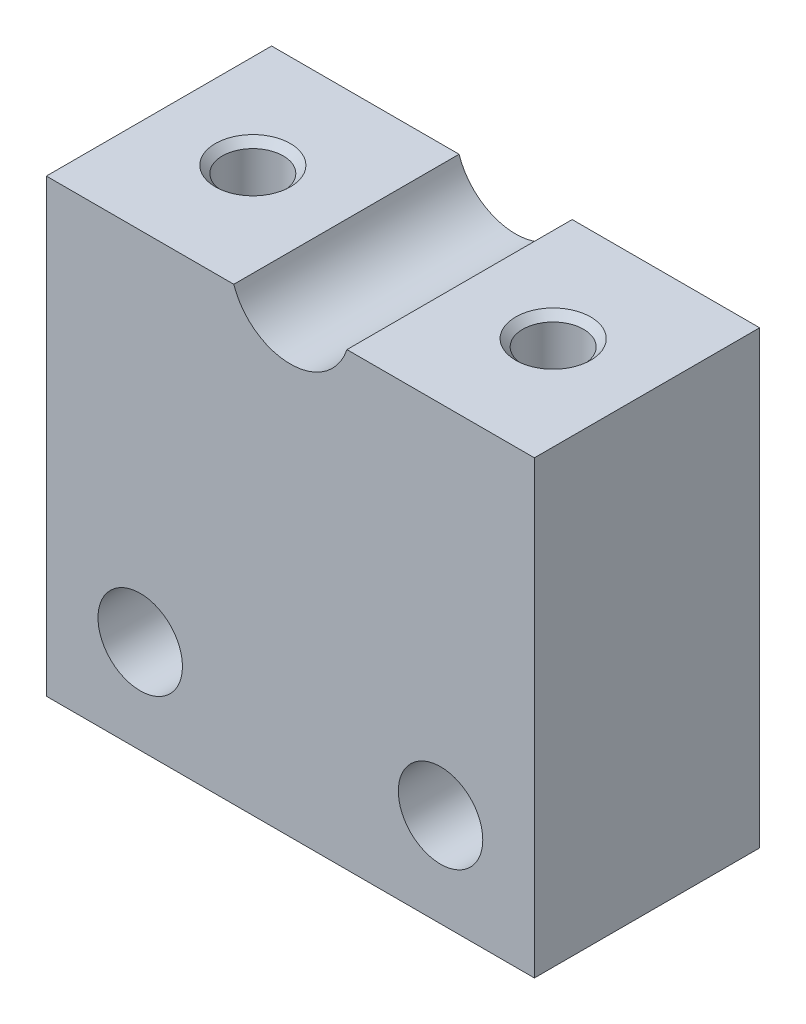
ISO-10303-21;
HEADER;
FILE_DESCRIPTION(('STEP AP214'),'2;1');
FILE_NAME('part.step','',(''),(''),'','','');
FILE_SCHEMA(('AUTOMOTIVE_DESIGN { 1 0 10303 214 1 1 1 1 }'));
ENDSEC;
DATA;
#1=APPLICATION_CONTEXT('core data for automotive mechanical design processes');
#2=APPLICATION_PROTOCOL_DEFINITION('international standard','automotive_design',2000,#1);
#3=PRODUCT_CONTEXT('',#1,'mechanical');
#4=PRODUCT('Part','Part','',(#3));
#5=PRODUCT_RELATED_PRODUCT_CATEGORY('part','',(#4));
#6=PRODUCT_DEFINITION_FORMATION('','',#4);
#7=PRODUCT_DEFINITION_CONTEXT('part definition',#1,'design');
#8=PRODUCT_DEFINITION('design','',#6,#7);
#9=PRODUCT_DEFINITION_SHAPE('','',#8);
#10=(LENGTH_UNIT() NAMED_UNIT(*) SI_UNIT(.MILLI.,.METRE.));
#11=(NAMED_UNIT(*) PLANE_ANGLE_UNIT() SI_UNIT($,.RADIAN.));
#12=(NAMED_UNIT(*) SI_UNIT($,.STERADIAN.) SOLID_ANGLE_UNIT());
#13=UNCERTAINTY_MEASURE_WITH_UNIT(LENGTH_MEASURE(1.E-05),#10,'distance_accuracy_value','');
#14=(GEOMETRIC_REPRESENTATION_CONTEXT(3) GLOBAL_UNCERTAINTY_ASSIGNED_CONTEXT((#13)) GLOBAL_UNIT_ASSIGNED_CONTEXT((#10,
#11,#12)) REPRESENTATION_CONTEXT('',''));
#15=CARTESIAN_POINT('',(0.,0.,0.));
#16=DIRECTION('',(0.,0.,1.));
#17=DIRECTION('',(1.,0.,0.));
#18=AXIS2_PLACEMENT_3D('',#15,#16,#17);
#19=CARTESIAN_POINT('',(13.,24.,-6.));
#20=DIRECTION('',(0.,1.,0.));
#21=DIRECTION('',(0.,0.,1.));
#22=AXIS2_PLACEMENT_3D('',#19,#20,#21);
#23=PLANE('',#22);
#24=CARTESIAN_POINT('',(8.,24.,0.));
#25=DIRECTION('',(0.,1.,0.));
#26=DIRECTION('',(0.,0.,1.));
#27=AXIS2_PLACEMENT_3D('',#24,#25,#26);
#28=CIRCLE('',#27,1.99999999999999);
#29=CARTESIAN_POINT('',(8.,24.,1.99999999999999));
#30=VERTEX_POINT('',#29);
#31=EDGE_CURVE('E11',#30,#30,#28,.F.);
#32=ORIENTED_EDGE('',*,*,#31,.T.);
#33=EDGE_LOOP('',(#32));
#34=FACE_BOUND('',#33,.T.);
#35=DIRECTION('',(0.,0.,-1.));
#36=VECTOR('',#35,1.);
#37=CARTESIAN_POINT('',(3.01340753964677,24.,6.));
#38=LINE('',#37,#36);
#39=CARTESIAN_POINT('',(3.01340753964677,24.,6.));
#40=VERTEX_POINT('',#39);
#41=CARTESIAN_POINT('',(3.01340753964677,24.,-6.));
#42=VERTEX_POINT('',#41);
#43=EDGE_CURVE('E133',#40,#42,#38,.T.);
#44=ORIENTED_EDGE('',*,*,#43,.F.);
#45=DIRECTION('',(-1.,0.,0.));
#46=VECTOR('',#45,1.);
#47=CARTESIAN_POINT('',(13.,24.,6.));
#48=LINE('',#47,#46);
#49=CARTESIAN_POINT('',(13.,24.,6.));
#50=VERTEX_POINT('',#49);
#51=EDGE_CURVE('E152',#50,#40,#48,.T.);
#52=ORIENTED_EDGE('',*,*,#51,.F.);
#53=DIRECTION('',(0.,0.,1.));
#54=VECTOR('',#53,1.);
#55=CARTESIAN_POINT('',(13.,24.,-6.));
#56=LINE('',#55,#54);
#57=CARTESIAN_POINT('',(13.,24.,-6.));
#58=VERTEX_POINT('',#57);
#59=EDGE_CURVE('E90',#58,#50,#56,.T.);
#60=ORIENTED_EDGE('',*,*,#59,.F.);
#61=DIRECTION('',(-1.,0.,0.));
#62=VECTOR('',#61,1.);
#63=CARTESIAN_POINT('',(13.,24.,-6.));
#64=LINE('',#63,#62);
#65=EDGE_CURVE('E142',#58,#42,#64,.T.);
#66=ORIENTED_EDGE('',*,*,#65,.T.);
#67=EDGE_LOOP('',(#44,#52,#60,#66));
#68=FACE_BOUND('',#67,.T.);
#69=ADVANCED_FACE('F39',(#34,#68),#23,.T.);
#70=CARTESIAN_POINT('',(13.,0.,-6.));
#71=DIRECTION('',(1.,0.,0.));
#72=DIRECTION('',(0.,0.,-1.));
#73=AXIS2_PLACEMENT_3D('',#70,#71,#72);
#74=PLANE('',#73);
#75=DIRECTION('',(0.,1.,0.));
#76=VECTOR('',#75,1.);
#77=CARTESIAN_POINT('',(13.,0.,6.));
#78=LINE('',#77,#76);
#79=CARTESIAN_POINT('',(13.,0.,6.));
#80=VERTEX_POINT('',#79);
#81=EDGE_CURVE('E135',#80,#50,#78,.T.);
#82=ORIENTED_EDGE('',*,*,#81,.F.);
#83=DIRECTION('',(0.,0.,1.));
#84=VECTOR('',#83,1.);
#85=CARTESIAN_POINT('',(13.,0.,-6.));
#86=LINE('',#85,#84);
#87=CARTESIAN_POINT('',(13.,0.,-6.));
#88=VERTEX_POINT('',#87);
#89=EDGE_CURVE('E64',#88,#80,#86,.T.);
#90=ORIENTED_EDGE('',*,*,#89,.F.);
#91=DIRECTION('',(0.,1.,0.));
#92=VECTOR('',#91,1.);
#93=CARTESIAN_POINT('',(13.,0.,-6.));
#94=LINE('',#93,#92);
#95=EDGE_CURVE('E138',#88,#58,#94,.T.);
#96=ORIENTED_EDGE('',*,*,#95,.T.);
#97=ORIENTED_EDGE('',*,*,#59,.T.);
#98=EDGE_LOOP('',(#82,#90,#96,#97));
#99=FACE_BOUND('',#98,.T.);
#100=ADVANCED_FACE('F186',(#99),#74,.T.);
#101=CARTESIAN_POINT('',(-13.,0.,-6.));
#102=DIRECTION('',(0.,-1.,0.));
#103=DIRECTION('',(0.,0.,-1.));
#104=AXIS2_PLACEMENT_3D('',#101,#102,#103);
#105=PLANE('',#104);
#106=DIRECTION('',(1.,0.,0.));
#107=VECTOR('',#106,1.);
#108=CARTESIAN_POINT('',(-13.,0.,6.));
#109=LINE('',#108,#107);
#110=CARTESIAN_POINT('',(-13.,0.,6.));
#111=VERTEX_POINT('',#110);
#112=EDGE_CURVE('E141',#111,#80,#109,.T.);
#113=ORIENTED_EDGE('',*,*,#112,.F.);
#114=DIRECTION('',(0.,0.,1.));
#115=VECTOR('',#114,1.);
#116=CARTESIAN_POINT('',(-13.,0.,-6.));
#117=LINE('',#116,#115);
#118=CARTESIAN_POINT('',(-13.,0.,-6.));
#119=VERTEX_POINT('',#118);
#120=EDGE_CURVE('E162',#119,#111,#117,.T.);
#121=ORIENTED_EDGE('',*,*,#120,.F.);
#122=DIRECTION('',(1.,0.,0.));
#123=VECTOR('',#122,1.);
#124=CARTESIAN_POINT('',(-13.,0.,-6.));
#125=LINE('',#124,#123);
#126=EDGE_CURVE('E147',#119,#88,#125,.T.);
#127=ORIENTED_EDGE('',*,*,#126,.T.);
#128=ORIENTED_EDGE('',*,*,#89,.T.);
#129=EDGE_LOOP('',(#113,#121,#127,#128));
#130=FACE_BOUND('',#129,.T.);
#131=ADVANCED_FACE('F193',(#130),#105,.T.);
#132=CARTESIAN_POINT('',(-13.,24.,-6.));
#133=DIRECTION('',(-1.,0.,0.));
#134=DIRECTION('',(0.,0.,1.));
#135=AXIS2_PLACEMENT_3D('',#132,#133,#134);
#136=PLANE('',#135);
#137=DIRECTION('',(0.,-1.,0.));
#138=VECTOR('',#137,1.);
#139=CARTESIAN_POINT('',(-13.,24.,6.));
#140=LINE('',#139,#138);
#141=CARTESIAN_POINT('',(-13.,24.,6.));
#142=VERTEX_POINT('',#141);
#143=EDGE_CURVE('E155',#142,#111,#140,.T.);
#144=ORIENTED_EDGE('',*,*,#143,.F.);
#145=DIRECTION('',(0.,0.,1.));
#146=VECTOR('',#145,1.);
#147=CARTESIAN_POINT('',(-13.,24.,-6.));
#148=LINE('',#147,#146);
#149=CARTESIAN_POINT('',(-13.,24.,-6.));
#150=VERTEX_POINT('',#149);
#151=EDGE_CURVE('E164',#150,#142,#148,.T.);
#152=ORIENTED_EDGE('',*,*,#151,.F.);
#153=DIRECTION('',(0.,-1.,0.));
#154=VECTOR('',#153,1.);
#155=CARTESIAN_POINT('',(-13.,24.,-6.));
#156=LINE('',#155,#154);
#157=EDGE_CURVE('E144',#150,#119,#156,.T.);
#158=ORIENTED_EDGE('',*,*,#157,.T.);
#159=ORIENTED_EDGE('',*,*,#120,.T.);
#160=EDGE_LOOP('',(#144,#152,#158,#159));
#161=FACE_BOUND('',#160,.T.);
#162=ADVANCED_FACE('F198',(#161),#136,.T.);
#163=CARTESIAN_POINT('',(-8.,24.,0.));
#164=DIRECTION('',(0.,1.,0.));
#165=DIRECTION('',(0.,0.,1.));
#166=AXIS2_PLACEMENT_3D('',#163,#164,#165);
#167=CIRCLE('',#166,1.99999999999999);
#168=CARTESIAN_POINT('',(-8.,24.,1.99999999999999));
#169=VERTEX_POINT('',#168);
#170=EDGE_CURVE('E170',#169,#169,#167,.F.);
#171=ORIENTED_EDGE('',*,*,#170,.T.);
#172=EDGE_LOOP('',(#171));
#173=FACE_BOUND('',#172,.T.);
#174=DIRECTION('',(0.,0.,-1.));
#175=VECTOR('',#174,1.);
#176=CARTESIAN_POINT('',(-3.01340753964677,24.,6.));
#177=LINE('',#176,#175);
#178=CARTESIAN_POINT('',(-3.01340753964676,24.,6.));
#179=VERTEX_POINT('',#178);
#180=CARTESIAN_POINT('',(-3.01340753964677,24.,-6.));
#181=VERTEX_POINT('',#180);
#182=EDGE_CURVE('E55',#179,#181,#177,.T.);
#183=ORIENTED_EDGE('',*,*,#182,.T.);
#184=EDGE_CURVE('E140',#181,#150,#64,.T.);
#185=ORIENTED_EDGE('',*,*,#184,.T.);
#186=ORIENTED_EDGE('',*,*,#151,.T.);
#187=EDGE_CURVE('E151',#179,#142,#48,.T.);
#188=ORIENTED_EDGE('',*,*,#187,.F.);
#189=EDGE_LOOP('',(#183,#185,#186,#188));
#190=FACE_BOUND('',#189,.T.);
#191=ADVANCED_FACE('F189',(#173,#190),#23,.T.);
#192=CARTESIAN_POINT('',(0.,0.,-6.));
#193=DIRECTION('',(0.,0.,1.));
#194=DIRECTION('',(1.,0.,0.));
#195=AXIS2_PLACEMENT_3D('',#192,#193,#194);
#196=PLANE('',#195);
#197=CARTESIAN_POINT('',(8.,5.,-6.));
#198=DIRECTION('',(0.,0.,1.));
#199=DIRECTION('',(1.,0.,0.));
#200=AXIS2_PLACEMENT_3D('',#197,#198,#199);
#201=CIRCLE('',#200,2.24999999999999);
#202=CARTESIAN_POINT('',(10.25,5.,-6.));
#203=VERTEX_POINT('',#202);
#204=EDGE_CURVE('E251',#203,#203,#201,.T.);
#205=ORIENTED_EDGE('',*,*,#204,.T.);
#206=EDGE_LOOP('',(#205));
#207=FACE_BOUND('',#206,.T.);
#208=CARTESIAN_POINT('',(-8.,5.,-6.));
#209=DIRECTION('',(0.,0.,1.));
#210=DIRECTION('',(1.,0.,0.));
#211=AXIS2_PLACEMENT_3D('',#208,#209,#210);
#212=CIRCLE('',#211,2.24999999999999);
#213=CARTESIAN_POINT('',(-5.75000000000001,5.,-6.));
#214=VERTEX_POINT('',#213);
#215=EDGE_CURVE('E118',#214,#214,#212,.T.);
#216=ORIENTED_EDGE('',*,*,#215,.T.);
#217=EDGE_LOOP('',(#216));
#218=FACE_BOUND('',#217,.T.);
#219=ORIENTED_EDGE('',*,*,#184,.F.);
#220=CARTESIAN_POINT('',(0.,25.,-6.));
#221=DIRECTION('',(0.,0.,-1.));
#222=DIRECTION('',(-1.,0.,0.));
#223=AXIS2_PLACEMENT_3D('',#220,#221,#222);
#224=CIRCLE('',#223,3.175);
#225=EDGE_CURVE('E121',#42,#181,#224,.T.);
#226=ORIENTED_EDGE('',*,*,#225,.F.);
#227=ORIENTED_EDGE('',*,*,#65,.F.);
#228=ORIENTED_EDGE('',*,*,#95,.F.);
#229=ORIENTED_EDGE('',*,*,#126,.F.);
#230=ORIENTED_EDGE('',*,*,#157,.F.);
#231=EDGE_LOOP('',(#219,#226,#227,#228,#229,#230));
#232=FACE_BOUND('',#231,.T.);
#233=ADVANCED_FACE('F197',(#207,#218,#232),#196,.F.);
#234=CARTESIAN_POINT('',(0.,0.,6.));
#235=DIRECTION('',(0.,0.,1.));
#236=DIRECTION('',(1.,0.,0.));
#237=AXIS2_PLACEMENT_3D('',#234,#235,#236);
#238=PLANE('',#237);
#239=CARTESIAN_POINT('',(8.,5.,6.));
#240=DIRECTION('',(0.,0.,1.));
#241=DIRECTION('',(1.,0.,0.));
#242=AXIS2_PLACEMENT_3D('',#239,#240,#241);
#243=CIRCLE('',#242,2.24999999999999);
#244=CARTESIAN_POINT('',(10.25,5.,6.));
#245=VERTEX_POINT('',#244);
#246=EDGE_CURVE('E254',#245,#245,#243,.T.);
#247=ORIENTED_EDGE('',*,*,#246,.F.);
#248=EDGE_LOOP('',(#247));
#249=FACE_BOUND('',#248,.T.);
#250=CARTESIAN_POINT('',(-8.,5.,6.));
#251=DIRECTION('',(0.,0.,1.));
#252=DIRECTION('',(1.,0.,0.));
#253=AXIS2_PLACEMENT_3D('',#250,#251,#252);
#254=CIRCLE('',#253,2.24999999999999);
#255=CARTESIAN_POINT('',(-5.75000000000001,5.,6.));
#256=VERTEX_POINT('',#255);
#257=EDGE_CURVE('E124',#256,#256,#254,.T.);
#258=ORIENTED_EDGE('',*,*,#257,.F.);
#259=EDGE_LOOP('',(#258));
#260=FACE_BOUND('',#259,.T.);
#261=CARTESIAN_POINT('',(0.,25.,6.));
#262=DIRECTION('',(0.,0.,-1.));
#263=DIRECTION('',(-1.,0.,0.));
#264=AXIS2_PLACEMENT_3D('',#261,#262,#263);
#265=CIRCLE('',#264,3.175);
#266=EDGE_CURVE('E128',#40,#179,#265,.T.);
#267=ORIENTED_EDGE('',*,*,#266,.T.);
#268=ORIENTED_EDGE('',*,*,#187,.T.);
#269=ORIENTED_EDGE('',*,*,#143,.T.);
#270=ORIENTED_EDGE('',*,*,#112,.T.);
#271=ORIENTED_EDGE('',*,*,#81,.T.);
#272=ORIENTED_EDGE('',*,*,#51,.T.);
#273=EDGE_LOOP('',(#267,#268,#269,#270,#271,#272));
#274=FACE_BOUND('',#273,.T.);
#275=ADVANCED_FACE('F204',(#249,#260,#274),#238,.T.);
#276=CARTESIAN_POINT('',(0.,25.,6.));
#277=DIRECTION('',(0.,0.,-1.));
#278=DIRECTION('',(-1.,0.,0.));
#279=AXIS2_PLACEMENT_3D('',#276,#277,#278);
#280=CYLINDRICAL_SURFACE('',#279,3.175);
#281=ORIENTED_EDGE('',*,*,#225,.T.);
#282=ORIENTED_EDGE('',*,*,#182,.F.);
#283=ORIENTED_EDGE('',*,*,#266,.F.);
#284=ORIENTED_EDGE('',*,*,#43,.T.);
#285=EDGE_LOOP('',(#281,#282,#283,#284));
#286=FACE_BOUND('',#285,.T.);
#287=ADVANCED_FACE('F226',(#286),#280,.F.);
#288=CARTESIAN_POINT('',(-8.,17.935884786356,0.));
#289=DIRECTION('',(0.,1.,0.));
#290=DIRECTION('',(0.,0.,1.));
#291=AXIS2_PLACEMENT_3D('',#288,#289,#290);
#292=CONICAL_SURFACE('',#291,1.62099999999999,1.04719755119677);
#293=CARTESIAN_POINT('',(-8.,17.,0.));
#294=VERTEX_POINT('',#293);
#295=VERTEX_LOOP('',#294);
#296=FACE_BOUND('',#295,.T.);
#297=CARTESIAN_POINT('',(-8.,17.935884786356,0.));
#298=DIRECTION('',(0.,1.,0.));
#299=DIRECTION('',(0.,0.,1.));
#300=AXIS2_PLACEMENT_3D('',#297,#298,#299);
#301=CIRCLE('',#300,1.62099999999999);
#302=CARTESIAN_POINT('',(-8.,17.935884786356,1.62099999999999));
#303=VERTEX_POINT('',#302);
#304=EDGE_CURVE('E117',#303,#303,#301,.T.);
#305=ORIENTED_EDGE('',*,*,#304,.T.);
#306=EDGE_LOOP('',(#305));
#307=FACE_BOUND('',#306,.T.);
#308=ADVANCED_FACE('F231',(#296,#307),#292,.F.);
#309=CARTESIAN_POINT('',(-8.,24.,0.));
#310=DIRECTION('',(0.,1.,0.));
#311=DIRECTION('',(0.,0.,1.));
#312=AXIS2_PLACEMENT_3D('',#309,#310,#311);
#313=CYLINDRICAL_SURFACE('',#312,1.62099999999999);
#314=CARTESIAN_POINT('',(-8.,23.621,0.));
#315=DIRECTION('',(0.,1.,0.));
#316=DIRECTION('',(0.,0.,1.));
#317=AXIS2_PLACEMENT_3D('',#314,#315,#316);
#318=CIRCLE('',#317,1.62099999999999);
#319=CARTESIAN_POINT('',(-8.,23.621,1.62099999999999));
#320=VERTEX_POINT('',#319);
#321=EDGE_CURVE('E161',#320,#320,#318,.T.);
#322=ORIENTED_EDGE('',*,*,#321,.T.);
#323=EDGE_LOOP('',(#322));
#324=FACE_BOUND('',#323,.T.);
#325=ORIENTED_EDGE('',*,*,#304,.F.);
#326=EDGE_LOOP('',(#325));
#327=FACE_BOUND('',#326,.T.);
#328=ADVANCED_FACE('F111',(#324,#327),#313,.F.);
#329=CARTESIAN_POINT('',(8.,17.935884786356,0.));
#330=DIRECTION('',(0.,1.,0.));
#331=DIRECTION('',(0.,0.,1.));
#332=AXIS2_PLACEMENT_3D('',#329,#330,#331);
#333=CONICAL_SURFACE('',#332,1.62099999999999,1.04719755119677);
#334=CARTESIAN_POINT('',(8.,17.,0.));
#335=VERTEX_POINT('',#334);
#336=VERTEX_LOOP('',#335);
#337=FACE_BOUND('',#336,.T.);
#338=CARTESIAN_POINT('',(8.,17.935884786356,0.));
#339=DIRECTION('',(0.,1.,0.));
#340=DIRECTION('',(0.,0.,1.));
#341=AXIS2_PLACEMENT_3D('',#338,#339,#340);
#342=CIRCLE('',#341,1.62099999999999);
#343=CARTESIAN_POINT('',(8.,17.935884786356,1.62099999999999));
#344=VERTEX_POINT('',#343);
#345=EDGE_CURVE('E115',#344,#344,#342,.T.);
#346=ORIENTED_EDGE('',*,*,#345,.T.);
#347=EDGE_LOOP('',(#346));
#348=FACE_BOUND('',#347,.T.);
#349=ADVANCED_FACE('F107',(#337,#348),#333,.F.);
#350=CARTESIAN_POINT('',(8.,24.,0.));
#351=DIRECTION('',(0.,1.,0.));
#352=DIRECTION('',(0.,0.,1.));
#353=AXIS2_PLACEMENT_3D('',#350,#351,#352);
#354=CYLINDRICAL_SURFACE('',#353,1.62099999999999);
#355=CARTESIAN_POINT('',(8.,23.621,0.));
#356=DIRECTION('',(0.,1.,0.));
#357=DIRECTION('',(0.,0.,1.));
#358=AXIS2_PLACEMENT_3D('',#355,#356,#357);
#359=CIRCLE('',#358,1.62099999999999);
#360=CARTESIAN_POINT('',(8.,23.621,1.62099999999999));
#361=VERTEX_POINT('',#360);
#362=EDGE_CURVE('E48',#361,#361,#359,.T.);
#363=ORIENTED_EDGE('',*,*,#362,.T.);
#364=EDGE_LOOP('',(#363));
#365=FACE_BOUND('',#364,.T.);
#366=ORIENTED_EDGE('',*,*,#345,.F.);
#367=EDGE_LOOP('',(#366));
#368=FACE_BOUND('',#367,.T.);
#369=ADVANCED_FACE('F110',(#365,#368),#354,.F.);
#370=CARTESIAN_POINT('',(-8.,5.,6.));
#371=DIRECTION('',(0.,0.,1.));
#372=DIRECTION('',(1.,0.,0.));
#373=AXIS2_PLACEMENT_3D('',#370,#371,#372);
#374=CYLINDRICAL_SURFACE('',#373,2.24999999999999);
#375=ORIENTED_EDGE('',*,*,#215,.F.);
#376=EDGE_LOOP('',(#375));
#377=FACE_BOUND('',#376,.T.);
#378=ORIENTED_EDGE('',*,*,#257,.T.);
#379=EDGE_LOOP('',(#378));
#380=FACE_BOUND('',#379,.T.);
#381=ADVANCED_FACE('F240',(#377,#380),#374,.F.);
#382=CARTESIAN_POINT('',(8.,5.,6.));
#383=DIRECTION('',(0.,0.,1.));
#384=DIRECTION('',(1.,0.,0.));
#385=AXIS2_PLACEMENT_3D('',#382,#383,#384);
#386=CYLINDRICAL_SURFACE('',#385,2.24999999999999);
#387=ORIENTED_EDGE('',*,*,#204,.F.);
#388=EDGE_LOOP('',(#387));
#389=FACE_BOUND('',#388,.T.);
#390=ORIENTED_EDGE('',*,*,#246,.T.);
#391=EDGE_LOOP('',(#390));
#392=FACE_BOUND('',#391,.T.);
#393=ADVANCED_FACE('F182',(#389,#392),#386,.F.);
#394=CARTESIAN_POINT('',(-8.,23.621,0.));
#395=DIRECTION('',(0.,1.,0.));
#396=DIRECTION('',(0.,0.,1.));
#397=AXIS2_PLACEMENT_3D('',#394,#395,#396);
#398=CONICAL_SURFACE('',#397,1.62099999999999,0.785398163397452);
#399=ORIENTED_EDGE('',*,*,#170,.F.);
#400=EDGE_LOOP('',(#399));
#401=FACE_BOUND('',#400,.T.);
#402=ORIENTED_EDGE('',*,*,#321,.F.);
#403=EDGE_LOOP('',(#402));
#404=FACE_BOUND('',#403,.T.);
#405=ADVANCED_FACE('F177',(#401,#404),#398,.F.);
#406=CARTESIAN_POINT('',(8.,23.621,0.));
#407=DIRECTION('',(0.,1.,0.));
#408=DIRECTION('',(0.,0.,1.));
#409=AXIS2_PLACEMENT_3D('',#406,#407,#408);
#410=CONICAL_SURFACE('',#409,1.62099999999999,0.785398163397452);
#411=ORIENTED_EDGE('',*,*,#31,.F.);
#412=EDGE_LOOP('',(#411));
#413=FACE_BOUND('',#412,.T.);
#414=ORIENTED_EDGE('',*,*,#362,.F.);
#415=EDGE_LOOP('',(#414));
#416=FACE_BOUND('',#415,.T.);
#417=ADVANCED_FACE('F42',(#413,#416),#410,.F.);
#418=CLOSED_SHELL('',(#69,#100,#131,#162,#191,#233,#275,#287,#308,#328,#349,#369,#381,#393,#405,#417));
#419=MANIFOLD_SOLID_BREP('B2',#418);
#420=ADVANCED_BREP_SHAPE_REPRESENTATION('',(#18,#419),#14);
#421=SHAPE_DEFINITION_REPRESENTATION(#9,#420);
ENDSEC;
END-ISO-10303-21;
